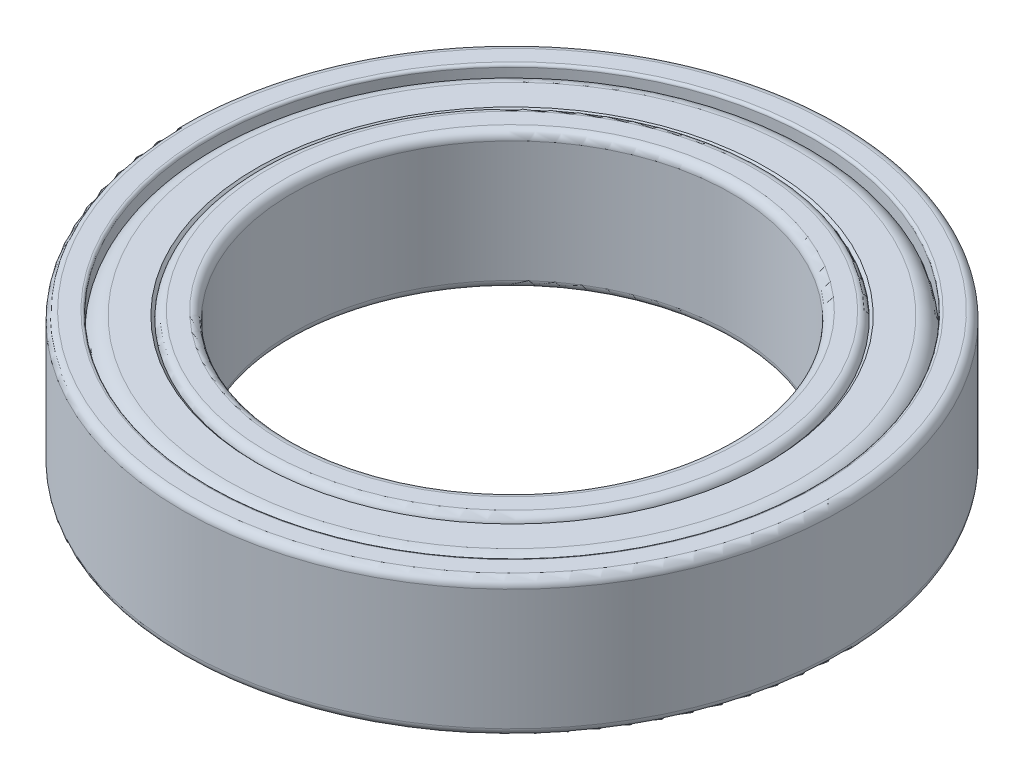
ISO-10303-21;
HEADER;
FILE_DESCRIPTION(('STEP AP214'),'2;1');
FILE_NAME('part.step','',(''),(''),'','','');
FILE_SCHEMA(('AUTOMOTIVE_DESIGN { 1 0 10303 214 1 1 1 1 }'));
ENDSEC;
DATA;
#1=APPLICATION_CONTEXT('core data for automotive mechanical design processes');
#2=APPLICATION_PROTOCOL_DEFINITION('international standard','automotive_design',2000,#1);
#3=PRODUCT_CONTEXT('',#1,'mechanical');
#4=PRODUCT('Part','Part','',(#3));
#5=PRODUCT_RELATED_PRODUCT_CATEGORY('part','',(#4));
#6=PRODUCT_DEFINITION_FORMATION('','',#4);
#7=PRODUCT_DEFINITION_CONTEXT('part definition',#1,'design');
#8=PRODUCT_DEFINITION('design','',#6,#7);
#9=PRODUCT_DEFINITION_SHAPE('','',#8);
#10=(LENGTH_UNIT() NAMED_UNIT(*) SI_UNIT(.MILLI.,.METRE.));
#11=(NAMED_UNIT(*) PLANE_ANGLE_UNIT() SI_UNIT($,.RADIAN.));
#12=(NAMED_UNIT(*) SI_UNIT($,.STERADIAN.) SOLID_ANGLE_UNIT());
#13=UNCERTAINTY_MEASURE_WITH_UNIT(LENGTH_MEASURE(1.E-05),#10,'distance_accuracy_value','');
#14=(GEOMETRIC_REPRESENTATION_CONTEXT(3) GLOBAL_UNCERTAINTY_ASSIGNED_CONTEXT((#13)) GLOBAL_UNIT_ASSIGNED_CONTEXT((#10,
#11,#12)) REPRESENTATION_CONTEXT('',''));
#15=CARTESIAN_POINT('',(0.,0.,0.));
#16=DIRECTION('',(0.,0.,1.));
#17=DIRECTION('',(1.,0.,0.));
#18=AXIS2_PLACEMENT_3D('',#15,#16,#17);
#19=CARTESIAN_POINT('',(0.,1.175,0.));
#20=DIRECTION('',(0.,1.,0.));
#21=DIRECTION('',(0.,0.,1.));
#22=AXIS2_PLACEMENT_3D('',#19,#20,#21);
#23=PLANE('',#22);
#24=CARTESIAN_POINT('',(0.,1.175,0.));
#25=DIRECTION('',(0.,1.,0.));
#26=DIRECTION('',(0.,0.,1.));
#27=AXIS2_PLACEMENT_3D('',#24,#25,#26);
#28=CIRCLE('',#27,4.65);
#29=CARTESIAN_POINT('',(0.,1.175,4.65));
#30=VERTEX_POINT('',#29);
#31=EDGE_CURVE('E12',#30,#30,#28,.F.);
#32=ORIENTED_EDGE('',*,*,#31,.T.);
#33=EDGE_LOOP('',(#32));
#34=FACE_BOUND('',#33,.T.);
#35=CARTESIAN_POINT('',(0.,1.175,0.));
#36=DIRECTION('',(0.,1.,0.));
#37=DIRECTION('',(0.,0.,1.));
#38=AXIS2_PLACEMENT_3D('',#35,#36,#37);
#39=CIRCLE('',#38,5.2);
#40=CARTESIAN_POINT('',(0.,1.175,5.2));
#41=VERTEX_POINT('',#40);
#42=EDGE_CURVE('E70',#41,#41,#39,.T.);
#43=ORIENTED_EDGE('',*,*,#42,.T.);
#44=EDGE_LOOP('',(#43));
#45=FACE_BOUND('',#44,.T.);
#46=ADVANCED_FACE('F50',(#34,#45),#23,.T.);
#47=CARTESIAN_POINT('',(0.,-1.175,0.));
#48=DIRECTION('',(0.,1.,0.));
#49=DIRECTION('',(0.,0.,1.));
#50=AXIS2_PLACEMENT_3D('',#47,#48,#49);
#51=PLANE('',#50);
#52=CARTESIAN_POINT('',(0.,-1.175,0.));
#53=DIRECTION('',(0.,1.,0.));
#54=DIRECTION('',(0.,0.,1.));
#55=AXIS2_PLACEMENT_3D('',#52,#53,#54);
#56=CIRCLE('',#55,4.65);
#57=CARTESIAN_POINT('',(0.,-1.175,4.65));
#58=VERTEX_POINT('',#57);
#59=EDGE_CURVE('E65',#58,#58,#56,.T.);
#60=ORIENTED_EDGE('',*,*,#59,.T.);
#61=EDGE_LOOP('',(#60));
#62=FACE_BOUND('',#61,.T.);
#63=CARTESIAN_POINT('',(0.,-1.175,0.));
#64=DIRECTION('',(0.,1.,0.));
#65=DIRECTION('',(0.,0.,1.));
#66=AXIS2_PLACEMENT_3D('',#63,#64,#65);
#67=CIRCLE('',#66,5.2);
#68=CARTESIAN_POINT('',(0.,-1.175,5.2));
#69=VERTEX_POINT('',#68);
#70=EDGE_CURVE('E73',#69,#69,#67,.F.);
#71=ORIENTED_EDGE('',*,*,#70,.T.);
#72=EDGE_LOOP('',(#71));
#73=FACE_BOUND('',#72,.T.);
#74=ADVANCED_FACE('F94',(#62,#73),#51,.F.);
#75=CARTESIAN_POINT('',(0.,1.175,0.));
#76=DIRECTION('',(0.,-1.,0.));
#77=DIRECTION('',(0.,0.,-1.));
#78=AXIS2_PLACEMENT_3D('',#75,#76,#77);
#79=CYLINDRICAL_SURFACE('',#78,5.5);
#80=CARTESIAN_POINT('',(0.,-0.875,0.));
#81=DIRECTION('',(0.,1.,0.));
#82=DIRECTION('',(0.,0.,1.));
#83=AXIS2_PLACEMENT_3D('',#80,#81,#82);
#84=CIRCLE('',#83,5.5);
#85=CARTESIAN_POINT('',(0.,-0.875,5.5));
#86=VERTEX_POINT('',#85);
#87=EDGE_CURVE('E76',#86,#86,#84,.T.);
#88=ORIENTED_EDGE('',*,*,#87,.T.);
#89=EDGE_LOOP('',(#88));
#90=FACE_BOUND('',#89,.T.);
#91=CARTESIAN_POINT('',(0.,0.875,0.));
#92=DIRECTION('',(0.,1.,0.));
#93=DIRECTION('',(0.,0.,1.));
#94=AXIS2_PLACEMENT_3D('',#91,#92,#93);
#95=CIRCLE('',#94,5.5);
#96=CARTESIAN_POINT('',(0.,0.875,5.5));
#97=VERTEX_POINT('',#96);
#98=EDGE_CURVE('E79',#97,#97,#95,.F.);
#99=ORIENTED_EDGE('',*,*,#98,.T.);
#100=EDGE_LOOP('',(#99));
#101=FACE_BOUND('',#100,.T.);
#102=ADVANCED_FACE('F83',(#90,#101),#79,.T.);
#103=CARTESIAN_POINT('',(0.,1.175,0.));
#104=DIRECTION('',(0.,-1.,0.));
#105=DIRECTION('',(0.,0.,-1.));
#106=AXIS2_PLACEMENT_3D('',#103,#104,#105);
#107=CYLINDRICAL_SURFACE('',#106,4.6);
#108=CARTESIAN_POINT('',(0.,-1.125,0.));
#109=DIRECTION('',(0.,1.,0.));
#110=DIRECTION('',(0.,0.,1.));
#111=AXIS2_PLACEMENT_3D('',#108,#109,#110);
#112=CIRCLE('',#111,4.6);
#113=CARTESIAN_POINT('',(0.,-1.125,4.6));
#114=VERTEX_POINT('',#113);
#115=EDGE_CURVE('E57',#114,#114,#112,.F.);
#116=ORIENTED_EDGE('',*,*,#115,.T.);
#117=EDGE_LOOP('',(#116));
#118=FACE_BOUND('',#117,.T.);
#119=CARTESIAN_POINT('',(0.,1.125,0.));
#120=DIRECTION('',(0.,1.,0.));
#121=DIRECTION('',(0.,0.,1.));
#122=AXIS2_PLACEMENT_3D('',#119,#120,#121);
#123=CIRCLE('',#122,4.6);
#124=CARTESIAN_POINT('',(0.,1.125,4.6));
#125=VERTEX_POINT('',#124);
#126=EDGE_CURVE('E61',#125,#125,#123,.T.);
#127=ORIENTED_EDGE('',*,*,#126,.T.);
#128=EDGE_LOOP('',(#127));
#129=FACE_BOUND('',#128,.T.);
#130=ADVANCED_FACE('F102',(#118,#129),#107,.F.);
#131=CARTESIAN_POINT('',(0.,-0.875,0.));
#132=DIRECTION('',(0.,1.,0.));
#133=DIRECTION('',(0.,0.,1.));
#134=AXIS2_PLACEMENT_3D('',#131,#132,#133);
#135=TOROIDAL_SURFACE('',#134,5.2,0.3);
#136=ORIENTED_EDGE('',*,*,#70,.F.);
#137=EDGE_LOOP('',(#136));
#138=FACE_BOUND('',#137,.T.);
#139=ORIENTED_EDGE('',*,*,#87,.F.);
#140=EDGE_LOOP('',(#139));
#141=FACE_BOUND('',#140,.T.);
#142=ADVANCED_FACE('F89',(#138,#141),#135,.T.);
#143=CARTESIAN_POINT('',(0.,0.875,0.));
#144=DIRECTION('',(0.,1.,0.));
#145=DIRECTION('',(0.,0.,1.));
#146=AXIS2_PLACEMENT_3D('',#143,#144,#145);
#147=TOROIDAL_SURFACE('',#146,5.2,0.3);
#148=ORIENTED_EDGE('',*,*,#98,.F.);
#149=EDGE_LOOP('',(#148));
#150=FACE_BOUND('',#149,.T.);
#151=ORIENTED_EDGE('',*,*,#42,.F.);
#152=EDGE_LOOP('',(#151));
#153=FACE_BOUND('',#152,.T.);
#154=ADVANCED_FACE('F85',(#150,#153),#147,.T.);
#155=CARTESIAN_POINT('',(0.,-1.175,0.));
#156=DIRECTION('',(0.,-1.,0.));
#157=DIRECTION('',(0.,0.,-1.));
#158=AXIS2_PLACEMENT_3D('',#155,#156,#157);
#159=CONICAL_SURFACE('',#158,4.65,0.785398163397448);
#160=ORIENTED_EDGE('',*,*,#115,.F.);
#161=EDGE_LOOP('',(#160));
#162=FACE_BOUND('',#161,.T.);
#163=ORIENTED_EDGE('',*,*,#59,.F.);
#164=EDGE_LOOP('',(#163));
#165=FACE_BOUND('',#164,.T.);
#166=ADVANCED_FACE('F88',(#162,#165),#159,.F.);
#167=CARTESIAN_POINT('',(0.,1.125,0.));
#168=DIRECTION('',(0.,1.,0.));
#169=DIRECTION('',(0.,0.,1.));
#170=AXIS2_PLACEMENT_3D('',#167,#168,#169);
#171=CONICAL_SURFACE('',#170,4.6,0.785398163397448);
#172=ORIENTED_EDGE('',*,*,#31,.F.);
#173=EDGE_LOOP('',(#172));
#174=FACE_BOUND('',#173,.T.);
#175=ORIENTED_EDGE('',*,*,#126,.F.);
#176=EDGE_LOOP('',(#175));
#177=FACE_BOUND('',#176,.T.);
#178=ADVANCED_FACE('F52',(#174,#177),#171,.F.);
#179=CLOSED_SHELL('',(#46,#74,#102,#130,#142,#154,#166,#178));
#180=MANIFOLD_SOLID_BREP('B2',#179);
#181=CARTESIAN_POINT('',(0.,1.25,0.));
#182=DIRECTION('',(0.,-1.,0.));
#183=DIRECTION('',(0.,0.,-1.));
#184=AXIS2_PLACEMENT_3D('',#181,#182,#183);
#185=CYLINDRICAL_SURFACE('',#184,4.);
#186=CARTESIAN_POINT('',(0.,-1.1,0.));
#187=DIRECTION('',(0.,1.,0.));
#188=DIRECTION('',(0.,0.,1.));
#189=AXIS2_PLACEMENT_3D('',#186,#187,#188);
#190=CIRCLE('',#189,4.);
#191=CARTESIAN_POINT('',(0.,-1.1,4.));
#192=VERTEX_POINT('',#191);
#193=EDGE_CURVE('E199',#192,#192,#190,.F.);
#194=ORIENTED_EDGE('',*,*,#193,.T.);
#195=EDGE_LOOP('',(#194));
#196=FACE_BOUND('',#195,.T.);
#197=CARTESIAN_POINT('',(0.,1.1,0.));
#198=DIRECTION('',(0.,1.,0.));
#199=DIRECTION('',(0.,0.,1.));
#200=AXIS2_PLACEMENT_3D('',#197,#198,#199);
#201=CIRCLE('',#200,4.);
#202=CARTESIAN_POINT('',(0.,1.1,4.));
#203=VERTEX_POINT('',#202);
#204=EDGE_CURVE('E202',#203,#203,#201,.T.);
#205=ORIENTED_EDGE('',*,*,#204,.T.);
#206=EDGE_LOOP('',(#205));
#207=FACE_BOUND('',#206,.T.);
#208=ADVANCED_FACE('F179',(#196,#207),#185,.F.);
#209=CARTESIAN_POINT('',(0.,1.25,0.));
#210=DIRECTION('',(0.,-1.,0.));
#211=DIRECTION('',(0.,0.,-1.));
#212=AXIS2_PLACEMENT_3D('',#209,#210,#211);
#213=CYLINDRICAL_SURFACE('',#212,4.6);
#214=CARTESIAN_POINT('',(0.,-1.1,0.));
#215=DIRECTION('',(0.,1.,0.));
#216=DIRECTION('',(0.,0.,1.));
#217=AXIS2_PLACEMENT_3D('',#214,#215,#216);
#218=CIRCLE('',#217,4.6);
#219=CARTESIAN_POINT('',(0.,-1.1,4.6));
#220=VERTEX_POINT('',#219);
#221=EDGE_CURVE('E49',#220,#220,#218,.T.);
#222=ORIENTED_EDGE('',*,*,#221,.T.);
#223=EDGE_LOOP('',(#222));
#224=FACE_BOUND('',#223,.T.);
#225=CARTESIAN_POINT('',(0.,1.1,0.));
#226=DIRECTION('',(0.,1.,0.));
#227=DIRECTION('',(0.,0.,1.));
#228=AXIS2_PLACEMENT_3D('',#225,#226,#227);
#229=CIRCLE('',#228,4.6);
#230=CARTESIAN_POINT('',(0.,1.1,4.6));
#231=VERTEX_POINT('',#230);
#232=EDGE_CURVE('E186',#231,#231,#229,.F.);
#233=ORIENTED_EDGE('',*,*,#232,.T.);
#234=EDGE_LOOP('',(#233));
#235=FACE_BOUND('',#234,.T.);
#236=ADVANCED_FACE('F227',(#224,#235),#213,.T.);
#237=CARTESIAN_POINT('',(0.,1.25,0.));
#238=DIRECTION('',(0.,1.,0.));
#239=DIRECTION('',(0.,0.,1.));
#240=AXIS2_PLACEMENT_3D('',#237,#238,#239);
#241=PLANE('',#240);
#242=CARTESIAN_POINT('',(0.,1.25,0.));
#243=DIRECTION('',(0.,1.,0.));
#244=DIRECTION('',(0.,0.,1.));
#245=AXIS2_PLACEMENT_3D('',#242,#243,#244);
#246=CIRCLE('',#245,4.15);
#247=CARTESIAN_POINT('',(0.,1.25,4.15));
#248=VERTEX_POINT('',#247);
#249=EDGE_CURVE('E190',#248,#248,#246,.F.);
#250=ORIENTED_EDGE('',*,*,#249,.T.);
#251=EDGE_LOOP('',(#250));
#252=FACE_BOUND('',#251,.T.);
#253=CARTESIAN_POINT('',(0.,1.25,0.));
#254=DIRECTION('',(0.,1.,0.));
#255=DIRECTION('',(0.,0.,1.));
#256=AXIS2_PLACEMENT_3D('',#253,#254,#255);
#257=CIRCLE('',#256,4.45);
#258=CARTESIAN_POINT('',(0.,1.25,4.45));
#259=VERTEX_POINT('',#258);
#260=EDGE_CURVE('E194',#259,#259,#257,.T.);
#261=ORIENTED_EDGE('',*,*,#260,.T.);
#262=EDGE_LOOP('',(#261));
#263=FACE_BOUND('',#262,.T.);
#264=ADVANCED_FACE('F233',(#252,#263),#241,.T.);
#265=CARTESIAN_POINT('',(0.,-1.25,0.));
#266=DIRECTION('',(0.,1.,0.));
#267=DIRECTION('',(0.,0.,1.));
#268=AXIS2_PLACEMENT_3D('',#265,#266,#267);
#269=PLANE('',#268);
#270=CARTESIAN_POINT('',(0.,-1.25,0.));
#271=DIRECTION('',(0.,1.,0.));
#272=DIRECTION('',(0.,0.,1.));
#273=AXIS2_PLACEMENT_3D('',#270,#271,#272);
#274=CIRCLE('',#273,4.15);
#275=CARTESIAN_POINT('',(0.,-1.25,4.15));
#276=VERTEX_POINT('',#275);
#277=EDGE_CURVE('E205',#276,#276,#274,.T.);
#278=ORIENTED_EDGE('',*,*,#277,.T.);
#279=EDGE_LOOP('',(#278));
#280=FACE_BOUND('',#279,.T.);
#281=CARTESIAN_POINT('',(0.,-1.25,0.));
#282=DIRECTION('',(0.,1.,0.));
#283=DIRECTION('',(0.,0.,1.));
#284=AXIS2_PLACEMENT_3D('',#281,#282,#283);
#285=CIRCLE('',#284,4.45);
#286=CARTESIAN_POINT('',(0.,-1.25,4.45));
#287=VERTEX_POINT('',#286);
#288=EDGE_CURVE('E208',#287,#287,#285,.F.);
#289=ORIENTED_EDGE('',*,*,#288,.T.);
#290=EDGE_LOOP('',(#289));
#291=FACE_BOUND('',#290,.T.);
#292=ADVANCED_FACE('F212',(#280,#291),#269,.F.);
#293=CARTESIAN_POINT('',(0.,-1.1,0.));
#294=DIRECTION('',(0.,1.,0.));
#295=DIRECTION('',(0.,0.,1.));
#296=AXIS2_PLACEMENT_3D('',#293,#294,#295);
#297=TOROIDAL_SURFACE('',#296,4.15,0.15);
#298=ORIENTED_EDGE('',*,*,#193,.F.);
#299=EDGE_LOOP('',(#298));
#300=FACE_BOUND('',#299,.T.);
#301=ORIENTED_EDGE('',*,*,#277,.F.);
#302=EDGE_LOOP('',(#301));
#303=FACE_BOUND('',#302,.T.);
#304=ADVANCED_FACE('F223',(#300,#303),#297,.T.);
#305=CARTESIAN_POINT('',(0.,1.1,0.));
#306=DIRECTION('',(0.,1.,0.));
#307=DIRECTION('',(0.,0.,1.));
#308=AXIS2_PLACEMENT_3D('',#305,#306,#307);
#309=TOROIDAL_SURFACE('',#308,4.15,0.15);
#310=ORIENTED_EDGE('',*,*,#249,.F.);
#311=EDGE_LOOP('',(#310));
#312=FACE_BOUND('',#311,.T.);
#313=ORIENTED_EDGE('',*,*,#204,.F.);
#314=EDGE_LOOP('',(#313));
#315=FACE_BOUND('',#314,.T.);
#316=ADVANCED_FACE('F217',(#312,#315),#309,.T.);
#317=CARTESIAN_POINT('',(0.,-1.1,0.));
#318=DIRECTION('',(0.,1.,0.));
#319=DIRECTION('',(0.,0.,1.));
#320=AXIS2_PLACEMENT_3D('',#317,#318,#319);
#321=TOROIDAL_SURFACE('',#320,4.45,0.15);
#322=ORIENTED_EDGE('',*,*,#288,.F.);
#323=EDGE_LOOP('',(#322));
#324=FACE_BOUND('',#323,.T.);
#325=ORIENTED_EDGE('',*,*,#221,.F.);
#326=EDGE_LOOP('',(#325));
#327=FACE_BOUND('',#326,.T.);
#328=ADVANCED_FACE('F214',(#324,#327),#321,.T.);
#329=CARTESIAN_POINT('',(0.,1.1,0.));
#330=DIRECTION('',(0.,1.,0.));
#331=DIRECTION('',(0.,0.,1.));
#332=AXIS2_PLACEMENT_3D('',#329,#330,#331);
#333=TOROIDAL_SURFACE('',#332,4.45,0.15);
#334=ORIENTED_EDGE('',*,*,#232,.F.);
#335=EDGE_LOOP('',(#334));
#336=FACE_BOUND('',#335,.T.);
#337=ORIENTED_EDGE('',*,*,#260,.F.);
#338=EDGE_LOOP('',(#337));
#339=FACE_BOUND('',#338,.T.);
#340=ADVANCED_FACE('F181',(#336,#339),#333,.T.);
#341=CLOSED_SHELL('',(#208,#236,#264,#292,#304,#316,#328,#340));
#342=MANIFOLD_SOLID_BREP('B7',#341);
#343=CARTESIAN_POINT('',(0.,1.25,0.));
#344=DIRECTION('',(0.,-1.,0.));
#345=DIRECTION('',(0.,0.,-1.));
#346=AXIS2_PLACEMENT_3D('',#343,#344,#345);
#347=CYLINDRICAL_SURFACE('',#346,5.5);
#348=CARTESIAN_POINT('',(0.,-1.2,0.));
#349=DIRECTION('',(0.,1.,0.));
#350=DIRECTION('',(0.,0.,1.));
#351=AXIS2_PLACEMENT_3D('',#348,#349,#350);
#352=CIRCLE('',#351,5.5);
#353=CARTESIAN_POINT('',(0.,-1.2,5.5));
#354=VERTEX_POINT('',#353);
#355=EDGE_CURVE('E308',#354,#354,#352,.F.);
#356=ORIENTED_EDGE('',*,*,#355,.T.);
#357=EDGE_LOOP('',(#356));
#358=FACE_BOUND('',#357,.T.);
#359=CARTESIAN_POINT('',(0.,1.2,0.));
#360=DIRECTION('',(0.,1.,0.));
#361=DIRECTION('',(0.,0.,1.));
#362=AXIS2_PLACEMENT_3D('',#359,#360,#361);
#363=CIRCLE('',#362,5.5);
#364=CARTESIAN_POINT('',(0.,1.2,5.5));
#365=VERTEX_POINT('',#364);
#366=EDGE_CURVE('E312',#365,#365,#363,.T.);
#367=ORIENTED_EDGE('',*,*,#366,.T.);
#368=EDGE_LOOP('',(#367));
#369=FACE_BOUND('',#368,.T.);
#370=ADVANCED_FACE('F301',(#358,#369),#347,.F.);
#371=CARTESIAN_POINT('',(0.,1.25,0.));
#372=DIRECTION('',(0.,-1.,0.));
#373=DIRECTION('',(0.,0.,-1.));
#374=AXIS2_PLACEMENT_3D('',#371,#372,#373);
#375=CYLINDRICAL_SURFACE('',#374,6.);
#376=CARTESIAN_POINT('',(0.,-1.1,0.));
#377=DIRECTION('',(0.,1.,0.));
#378=DIRECTION('',(0.,0.,1.));
#379=AXIS2_PLACEMENT_3D('',#376,#377,#378);
#380=CIRCLE('',#379,6.);
#381=CARTESIAN_POINT('',(0.,-1.1,6.));
#382=VERTEX_POINT('',#381);
#383=EDGE_CURVE('E327',#382,#382,#380,.T.);
#384=ORIENTED_EDGE('',*,*,#383,.T.);
#385=EDGE_LOOP('',(#384));
#386=FACE_BOUND('',#385,.T.);
#387=CARTESIAN_POINT('',(0.,1.1,0.));
#388=DIRECTION('',(0.,1.,0.));
#389=DIRECTION('',(0.,0.,1.));
#390=AXIS2_PLACEMENT_3D('',#387,#388,#389);
#391=CIRCLE('',#390,6.);
#392=CARTESIAN_POINT('',(0.,1.1,6.));
#393=VERTEX_POINT('',#392);
#394=EDGE_CURVE('E330',#393,#393,#391,.F.);
#395=ORIENTED_EDGE('',*,*,#394,.T.);
#396=EDGE_LOOP('',(#395));
#397=FACE_BOUND('',#396,.T.);
#398=ADVANCED_FACE('F334',(#386,#397),#375,.T.);
#399=CARTESIAN_POINT('',(0.,1.25,0.));
#400=DIRECTION('',(0.,1.,0.));
#401=DIRECTION('',(0.,0.,1.));
#402=AXIS2_PLACEMENT_3D('',#399,#400,#401);
#403=PLANE('',#402);
#404=CARTESIAN_POINT('',(0.,1.25,0.));
#405=DIRECTION('',(0.,1.,0.));
#406=DIRECTION('',(0.,0.,1.));
#407=AXIS2_PLACEMENT_3D('',#404,#405,#406);
#408=CIRCLE('',#407,5.55);
#409=CARTESIAN_POINT('',(0.,1.25,5.55));
#410=VERTEX_POINT('',#409);
#411=EDGE_CURVE('E178',#410,#410,#408,.F.);
#412=ORIENTED_EDGE('',*,*,#411,.T.);
#413=EDGE_LOOP('',(#412));
#414=FACE_BOUND('',#413,.T.);
#415=CARTESIAN_POINT('',(0.,1.25,0.));
#416=DIRECTION('',(0.,1.,0.));
#417=DIRECTION('',(0.,0.,1.));
#418=AXIS2_PLACEMENT_3D('',#415,#416,#417);
#419=CIRCLE('',#418,5.85);
#420=CARTESIAN_POINT('',(0.,1.25,5.85));
#421=VERTEX_POINT('',#420);
#422=EDGE_CURVE('E321',#421,#421,#419,.T.);
#423=ORIENTED_EDGE('',*,*,#422,.T.);
#424=EDGE_LOOP('',(#423));
#425=FACE_BOUND('',#424,.T.);
#426=ADVANCED_FACE('F344',(#414,#425),#403,.T.);
#427=CARTESIAN_POINT('',(0.,-1.25,0.));
#428=DIRECTION('',(0.,1.,0.));
#429=DIRECTION('',(0.,0.,1.));
#430=AXIS2_PLACEMENT_3D('',#427,#428,#429);
#431=PLANE('',#430);
#432=CARTESIAN_POINT('',(0.,-1.25,0.));
#433=DIRECTION('',(0.,1.,0.));
#434=DIRECTION('',(0.,0.,1.));
#435=AXIS2_PLACEMENT_3D('',#432,#433,#434);
#436=CIRCLE('',#435,5.55);
#437=CARTESIAN_POINT('',(0.,-1.25,5.55));
#438=VERTEX_POINT('',#437);
#439=EDGE_CURVE('E316',#438,#438,#436,.T.);
#440=ORIENTED_EDGE('',*,*,#439,.T.);
#441=EDGE_LOOP('',(#440));
#442=FACE_BOUND('',#441,.T.);
#443=CARTESIAN_POINT('',(0.,-1.25,0.));
#444=DIRECTION('',(0.,1.,0.));
#445=DIRECTION('',(0.,0.,1.));
#446=AXIS2_PLACEMENT_3D('',#443,#444,#445);
#447=CIRCLE('',#446,5.85);
#448=CARTESIAN_POINT('',(0.,-1.25,5.85));
#449=VERTEX_POINT('',#448);
#450=EDGE_CURVE('E324',#449,#449,#447,.F.);
#451=ORIENTED_EDGE('',*,*,#450,.T.);
#452=EDGE_LOOP('',(#451));
#453=FACE_BOUND('',#452,.T.);
#454=ADVANCED_FACE('F346',(#442,#453),#431,.F.);
#455=CARTESIAN_POINT('',(0.,-1.1,0.));
#456=DIRECTION('',(0.,1.,0.));
#457=DIRECTION('',(0.,0.,1.));
#458=AXIS2_PLACEMENT_3D('',#455,#456,#457);
#459=TOROIDAL_SURFACE('',#458,5.85,0.15);
#460=ORIENTED_EDGE('',*,*,#450,.F.);
#461=EDGE_LOOP('',(#460));
#462=FACE_BOUND('',#461,.T.);
#463=ORIENTED_EDGE('',*,*,#383,.F.);
#464=EDGE_LOOP('',(#463));
#465=FACE_BOUND('',#464,.T.);
#466=ADVANCED_FACE('F340',(#462,#465),#459,.T.);
#467=CARTESIAN_POINT('',(0.,1.1,0.));
#468=DIRECTION('',(0.,1.,0.));
#469=DIRECTION('',(0.,0.,1.));
#470=AXIS2_PLACEMENT_3D('',#467,#468,#469);
#471=TOROIDAL_SURFACE('',#470,5.85,0.15);
#472=ORIENTED_EDGE('',*,*,#394,.F.);
#473=EDGE_LOOP('',(#472));
#474=FACE_BOUND('',#473,.T.);
#475=ORIENTED_EDGE('',*,*,#422,.F.);
#476=EDGE_LOOP('',(#475));
#477=FACE_BOUND('',#476,.T.);
#478=ADVANCED_FACE('F336',(#474,#477),#471,.T.);
#479=CARTESIAN_POINT('',(0.,-1.2,0.));
#480=DIRECTION('',(0.,1.,0.));
#481=DIRECTION('',(0.,0.,1.));
#482=AXIS2_PLACEMENT_3D('',#479,#480,#481);
#483=TOROIDAL_SURFACE('',#482,5.55,0.05);
#484=ORIENTED_EDGE('',*,*,#355,.F.);
#485=EDGE_LOOP('',(#484));
#486=FACE_BOUND('',#485,.T.);
#487=ORIENTED_EDGE('',*,*,#439,.F.);
#488=EDGE_LOOP('',(#487));
#489=FACE_BOUND('',#488,.T.);
#490=ADVANCED_FACE('F339',(#486,#489),#483,.T.);
#491=CARTESIAN_POINT('',(0.,1.2,0.));
#492=DIRECTION('',(0.,1.,0.));
#493=DIRECTION('',(0.,0.,1.));
#494=AXIS2_PLACEMENT_3D('',#491,#492,#493);
#495=TOROIDAL_SURFACE('',#494,5.55,0.05);
#496=ORIENTED_EDGE('',*,*,#411,.F.);
#497=EDGE_LOOP('',(#496));
#498=FACE_BOUND('',#497,.T.);
#499=ORIENTED_EDGE('',*,*,#366,.F.);
#500=EDGE_LOOP('',(#499));
#501=FACE_BOUND('',#500,.T.);
#502=ADVANCED_FACE('F303',(#498,#501),#495,.T.);
#503=CLOSED_SHELL('',(#370,#398,#426,#454,#466,#478,#490,#502));
#504=MANIFOLD_SOLID_BREP('B44',#503);
#505=ADVANCED_BREP_SHAPE_REPRESENTATION('',(#18,#180,#342,#504),#14);
#506=SHAPE_DEFINITION_REPRESENTATION(#9,#505);
ENDSEC;
END-ISO-10303-21;
